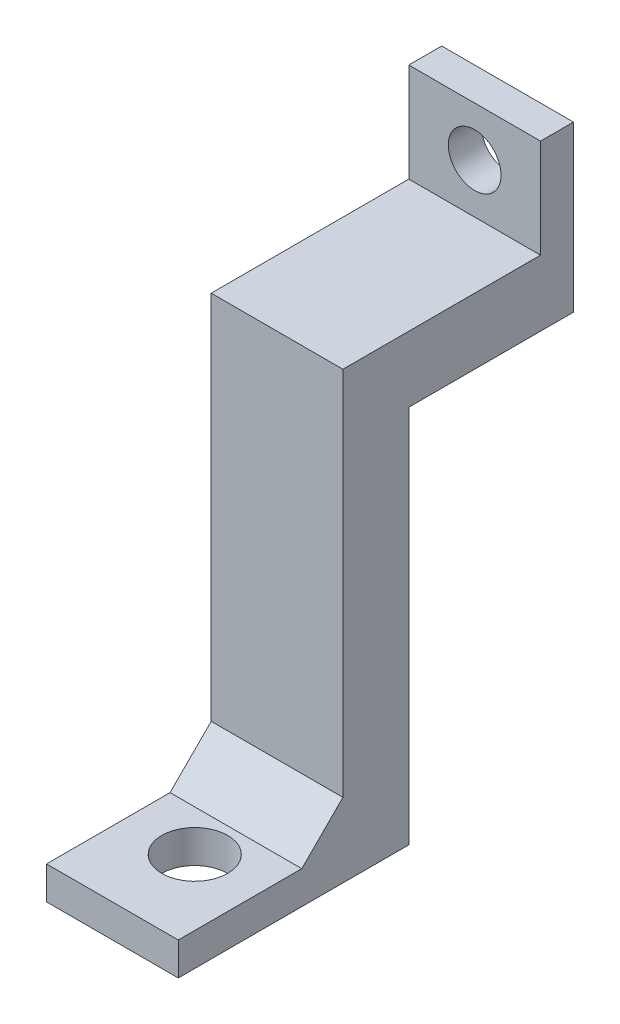
ISO-10303-21;
HEADER;
FILE_DESCRIPTION(('STEP AP214'),'2;1');
FILE_NAME('part.step','',(''),(''),'','','');
FILE_SCHEMA(('AUTOMOTIVE_DESIGN { 1 0 10303 214 1 1 1 1 }'));
ENDSEC;
DATA;
#1=APPLICATION_CONTEXT('core data for automotive mechanical design processes');
#2=APPLICATION_PROTOCOL_DEFINITION('international standard','automotive_design',2000,#1);
#3=PRODUCT_CONTEXT('',#1,'mechanical');
#4=PRODUCT('Part','Part','',(#3));
#5=PRODUCT_RELATED_PRODUCT_CATEGORY('part','',(#4));
#6=PRODUCT_DEFINITION_FORMATION('','',#4);
#7=PRODUCT_DEFINITION_CONTEXT('part definition',#1,'design');
#8=PRODUCT_DEFINITION('design','',#6,#7);
#9=PRODUCT_DEFINITION_SHAPE('','',#8);
#10=(LENGTH_UNIT() NAMED_UNIT(*) SI_UNIT(.MILLI.,.METRE.));
#11=(NAMED_UNIT(*) PLANE_ANGLE_UNIT() SI_UNIT($,.RADIAN.));
#12=(NAMED_UNIT(*) SI_UNIT($,.STERADIAN.) SOLID_ANGLE_UNIT());
#13=UNCERTAINTY_MEASURE_WITH_UNIT(LENGTH_MEASURE(1.E-05),#10,'distance_accuracy_value','');
#14=(GEOMETRIC_REPRESENTATION_CONTEXT(3) GLOBAL_UNCERTAINTY_ASSIGNED_CONTEXT((#13)) GLOBAL_UNIT_ASSIGNED_CONTEXT((#10,
#11,#12)) REPRESENTATION_CONTEXT('',''));
#15=CARTESIAN_POINT('',(0.,0.,0.));
#16=DIRECTION('',(0.,0.,1.));
#17=DIRECTION('',(1.,0.,0.));
#18=AXIS2_PLACEMENT_3D('',#15,#16,#17);
#19=CARTESIAN_POINT('',(8.,0.,-60.2233250620348));
#20=DIRECTION('',(0.,-1.,0.));
#21=DIRECTION('',(0.,0.,-1.));
#22=AXIS2_PLACEMENT_3D('',#19,#20,#21);
#23=PLANE('',#22);
#24=CARTESIAN_POINT('',(4.,0.,-65.2233250620348));
#25=DIRECTION('',(0.,1.,0.));
#26=DIRECTION('',(0.,0.,1.));
#27=AXIS2_PLACEMENT_3D('',#24,#25,#26);
#28=CIRCLE('',#27,2.);
#29=CARTESIAN_POINT('',(4.,0.,-63.2233250620348));
#30=VERTEX_POINT('',#29);
#31=EDGE_CURVE('E267',#30,#30,#28,.T.);
#32=ORIENTED_EDGE('',*,*,#31,.F.);
#33=EDGE_LOOP('',(#32));
#34=FACE_BOUND('',#33,.T.);
#35=DIRECTION('',(0.,0.,1.));
#36=VECTOR('',#35,1.);
#37=CARTESIAN_POINT('',(0.,0.,-60.2233250620348));
#38=LINE('',#37,#36);
#39=CARTESIAN_POINT('',(0.,0.,-67.7233250620348));
#40=VERTEX_POINT('',#39);
#41=CARTESIAN_POINT('',(0.,0.,-60.2233250620348));
#42=VERTEX_POINT('',#41);
#43=EDGE_CURVE('E169',#40,#42,#38,.T.);
#44=ORIENTED_EDGE('',*,*,#43,.T.);
#45=DIRECTION('',(-1.,0.,0.));
#46=VECTOR('',#45,1.);
#47=CARTESIAN_POINT('',(8.,0.,-60.2233250620348));
#48=LINE('',#47,#46);
#49=CARTESIAN_POINT('',(8.,0.,-60.2233250620348));
#50=VERTEX_POINT('',#49);
#51=EDGE_CURVE('E11',#50,#42,#48,.T.);
#52=ORIENTED_EDGE('',*,*,#51,.F.);
#53=DIRECTION('',(0.,0.,1.));
#54=VECTOR('',#53,1.);
#55=CARTESIAN_POINT('',(8.,0.,-60.2233250620348));
#56=LINE('',#55,#54);
#57=CARTESIAN_POINT('',(8.,0.,-67.7233250620348));
#58=VERTEX_POINT('',#57);
#59=EDGE_CURVE('E201',#58,#50,#56,.T.);
#60=ORIENTED_EDGE('',*,*,#59,.F.);
#61=DIRECTION('',(-1.,0.,0.));
#62=VECTOR('',#61,1.);
#63=CARTESIAN_POINT('',(8.,0.,-67.7233250620348));
#64=LINE('',#63,#62);
#65=EDGE_CURVE('E165',#58,#40,#64,.T.);
#66=ORIENTED_EDGE('',*,*,#65,.T.);
#67=EDGE_LOOP('',(#44,#52,#60,#66));
#68=FACE_BOUND('',#67,.T.);
#69=ADVANCED_FACE('F47',(#34,#68),#23,.F.);
#70=CARTESIAN_POINT('',(8.,0.,-60.2233250620348));
#71=DIRECTION('',(0.,0.,-1.));
#72=DIRECTION('',(-1.,0.,0.));
#73=AXIS2_PLACEMENT_3D('',#70,#71,#72);
#74=PLANE('',#73);
#75=DIRECTION('',(0.,-1.,0.));
#76=VECTOR('',#75,1.);
#77=CARTESIAN_POINT('',(0.,0.,-60.2233250620348));
#78=LINE('',#77,#76);
#79=CARTESIAN_POINT('',(0.,-2.,-60.2233250620348));
#80=VERTEX_POINT('',#79);
#81=EDGE_CURVE('E173',#42,#80,#78,.T.);
#82=ORIENTED_EDGE('',*,*,#81,.T.);
#83=DIRECTION('',(-1.,0.,0.));
#84=VECTOR('',#83,1.);
#85=CARTESIAN_POINT('',(8.,-2.,-60.2233250620348));
#86=LINE('',#85,#84);
#87=CARTESIAN_POINT('',(8.,-2.,-60.2233250620348));
#88=VERTEX_POINT('',#87);
#89=EDGE_CURVE('E57',#88,#80,#86,.T.);
#90=ORIENTED_EDGE('',*,*,#89,.F.);
#91=DIRECTION('',(0.,-1.,0.));
#92=VECTOR('',#91,1.);
#93=CARTESIAN_POINT('',(8.,0.,-60.2233250620348));
#94=LINE('',#93,#92);
#95=EDGE_CURVE('E117',#50,#88,#94,.T.);
#96=ORIENTED_EDGE('',*,*,#95,.F.);
#97=ORIENTED_EDGE('',*,*,#51,.T.);
#98=EDGE_LOOP('',(#82,#90,#96,#97));
#99=FACE_BOUND('',#98,.T.);
#100=ADVANCED_FACE('F235',(#99),#74,.F.);
#101=CARTESIAN_POINT('',(8.,-2.,-70.2233250620348));
#102=DIRECTION('',(0.,1.,0.));
#103=DIRECTION('',(0.,0.,1.));
#104=AXIS2_PLACEMENT_3D('',#101,#102,#103);
#105=PLANE('',#104);
#106=CARTESIAN_POINT('',(4.,-2.,-65.2233250620348));
#107=DIRECTION('',(0.,1.,0.));
#108=DIRECTION('',(0.,0.,1.));
#109=AXIS2_PLACEMENT_3D('',#106,#107,#108);
#110=CIRCLE('',#109,2.);
#111=CARTESIAN_POINT('',(4.,-2.,-63.2233250620348));
#112=VERTEX_POINT('',#111);
#113=EDGE_CURVE('E50',#112,#112,#110,.T.);
#114=ORIENTED_EDGE('',*,*,#113,.T.);
#115=EDGE_LOOP('',(#114));
#116=FACE_BOUND('',#115,.T.);
#117=DIRECTION('',(0.,0.,-1.));
#118=VECTOR('',#117,1.);
#119=CARTESIAN_POINT('',(0.,-2.,-70.2233250620348));
#120=LINE('',#119,#118);
#121=CARTESIAN_POINT('',(0.,-2.,-74.2233250620348));
#122=VERTEX_POINT('',#121);
#123=EDGE_CURVE('E178',#80,#122,#120,.T.);
#124=ORIENTED_EDGE('',*,*,#123,.T.);
#125=DIRECTION('',(-1.,0.,0.));
#126=VECTOR('',#125,1.);
#127=CARTESIAN_POINT('',(8.,-2.,-74.2233250620348));
#128=LINE('',#127,#126);
#129=CARTESIAN_POINT('',(8.,-2.,-74.2233250620348));
#130=VERTEX_POINT('',#129);
#131=EDGE_CURVE('E224',#130,#122,#128,.T.);
#132=ORIENTED_EDGE('',*,*,#131,.F.);
#133=DIRECTION('',(0.,0.,-1.));
#134=VECTOR('',#133,1.);
#135=CARTESIAN_POINT('',(8.,-2.,-60.2233250620348));
#136=LINE('',#135,#134);
#137=EDGE_CURVE('E234',#88,#130,#136,.T.);
#138=ORIENTED_EDGE('',*,*,#137,.F.);
#139=ORIENTED_EDGE('',*,*,#89,.T.);
#140=EDGE_LOOP('',(#124,#132,#138,#139));
#141=FACE_BOUND('',#140,.T.);
#142=ADVANCED_FACE('F232',(#116,#141),#105,.F.);
#143=CARTESIAN_POINT('',(8.,-2.,-74.2233250620348));
#144=DIRECTION('',(0.,0.,1.));
#145=DIRECTION('',(1.,0.,0.));
#146=AXIS2_PLACEMENT_3D('',#143,#144,#145);
#147=PLANE('',#146);
#148=DIRECTION('',(0.,1.,0.));
#149=VECTOR('',#148,1.);
#150=CARTESIAN_POINT('',(0.,-2.,-74.2233250620348));
#151=LINE('',#150,#149);
#152=CARTESIAN_POINT('',(0.,21.0176670275042,-74.2233250620348));
#153=VERTEX_POINT('',#152);
#154=EDGE_CURVE('E181',#122,#153,#151,.T.);
#155=ORIENTED_EDGE('',*,*,#154,.T.);
#156=DIRECTION('',(-1.,0.,0.));
#157=VECTOR('',#156,1.);
#158=CARTESIAN_POINT('',(8.,21.0176670275042,-74.2233250620348));
#159=LINE('',#158,#157);
#160=CARTESIAN_POINT('',(8.,21.0176670275042,-74.2233250620348));
#161=VERTEX_POINT('',#160);
#162=EDGE_CURVE('E220',#161,#153,#159,.T.);
#163=ORIENTED_EDGE('',*,*,#162,.F.);
#164=DIRECTION('',(0.,1.,0.));
#165=VECTOR('',#164,1.);
#166=CARTESIAN_POINT('',(8.,-2.,-74.2233250620348));
#167=LINE('',#166,#165);
#168=EDGE_CURVE('E255',#130,#161,#167,.T.);
#169=ORIENTED_EDGE('',*,*,#168,.F.);
#170=ORIENTED_EDGE('',*,*,#131,.T.);
#171=EDGE_LOOP('',(#155,#163,#169,#170));
#172=FACE_BOUND('',#171,.T.);
#173=ADVANCED_FACE('F245',(#172),#147,.F.);
#174=CARTESIAN_POINT('',(8.,21.0176670275042,-74.2233250620348));
#175=DIRECTION('',(0.,1.,0.));
#176=DIRECTION('',(0.,0.,1.));
#177=AXIS2_PLACEMENT_3D('',#174,#175,#176);
#178=PLANE('',#177);
#179=DIRECTION('',(0.,0.,-1.));
#180=VECTOR('',#179,1.);
#181=CARTESIAN_POINT('',(0.,21.0176670275042,-74.2233250620348));
#182=LINE('',#181,#180);
#183=CARTESIAN_POINT('',(0.,21.0176670275042,-84.2233250620348));
#184=VERTEX_POINT('',#183);
#185=EDGE_CURVE('E184',#153,#184,#182,.T.);
#186=ORIENTED_EDGE('',*,*,#185,.T.);
#187=DIRECTION('',(-1.,0.,0.));
#188=VECTOR('',#187,1.);
#189=CARTESIAN_POINT('',(8.,21.0176670275042,-84.2233250620348));
#190=LINE('',#189,#188);
#191=CARTESIAN_POINT('',(8.,21.0176670275042,-84.2233250620348));
#192=VERTEX_POINT('',#191);
#193=EDGE_CURVE('E216',#192,#184,#190,.T.);
#194=ORIENTED_EDGE('',*,*,#193,.F.);
#195=DIRECTION('',(0.,0.,-1.));
#196=VECTOR('',#195,1.);
#197=CARTESIAN_POINT('',(8.,21.0176670275042,-74.2233250620348));
#198=LINE('',#197,#196);
#199=EDGE_CURVE('E251',#161,#192,#198,.T.);
#200=ORIENTED_EDGE('',*,*,#199,.F.);
#201=ORIENTED_EDGE('',*,*,#162,.T.);
#202=EDGE_LOOP('',(#186,#194,#200,#201));
#203=FACE_BOUND('',#202,.T.);
#204=ADVANCED_FACE('F249',(#203),#178,.F.);
#205=CARTESIAN_POINT('',(8.,21.0176670275042,-84.2233250620348));
#206=DIRECTION('',(0.,0.,1.));
#207=DIRECTION('',(1.,0.,0.));
#208=AXIS2_PLACEMENT_3D('',#205,#206,#207);
#209=PLANE('',#208);
#210=CARTESIAN_POINT('',(4.,28.0176670275042,-84.2233250620348));
#211=DIRECTION('',(0.,0.,1.));
#212=DIRECTION('',(1.,0.,0.));
#213=AXIS2_PLACEMENT_3D('',#210,#211,#212);
#214=CIRCLE('',#213,1.6);
#215=CARTESIAN_POINT('',(5.6,28.0176670275042,-84.2233250620348));
#216=VERTEX_POINT('',#215);
#217=EDGE_CURVE('E174',#216,#216,#214,.T.);
#218=ORIENTED_EDGE('',*,*,#217,.T.);
#219=EDGE_LOOP('',(#218));
#220=FACE_BOUND('',#219,.T.);
#221=DIRECTION('',(0.,1.,0.));
#222=VECTOR('',#221,1.);
#223=CARTESIAN_POINT('',(0.,21.0176670275042,-84.2233250620348));
#224=LINE('',#223,#222);
#225=CARTESIAN_POINT('',(0.,31.0176670275042,-84.2233250620348));
#226=VERTEX_POINT('',#225);
#227=EDGE_CURVE('E187',#184,#226,#224,.T.);
#228=ORIENTED_EDGE('',*,*,#227,.T.);
#229=DIRECTION('',(-1.,0.,0.));
#230=VECTOR('',#229,1.);
#231=CARTESIAN_POINT('',(8.,31.0176670275042,-84.2233250620348));
#232=LINE('',#231,#230);
#233=CARTESIAN_POINT('',(8.,31.0176670275042,-84.2233250620348));
#234=VERTEX_POINT('',#233);
#235=EDGE_CURVE('E212',#234,#226,#232,.T.);
#236=ORIENTED_EDGE('',*,*,#235,.F.);
#237=DIRECTION('',(0.,1.,0.));
#238=VECTOR('',#237,1.);
#239=CARTESIAN_POINT('',(8.,21.0176670275042,-84.2233250620348));
#240=LINE('',#239,#238);
#241=EDGE_CURVE('E254',#192,#234,#240,.T.);
#242=ORIENTED_EDGE('',*,*,#241,.F.);
#243=ORIENTED_EDGE('',*,*,#193,.T.);
#244=EDGE_LOOP('',(#228,#236,#242,#243));
#245=FACE_BOUND('',#244,.T.);
#246=ADVANCED_FACE('F298',(#220,#245),#209,.F.);
#247=CARTESIAN_POINT('',(8.,31.0176670275042,-84.2233250620348));
#248=DIRECTION('',(0.,-1.,0.));
#249=DIRECTION('',(0.,0.,-1.));
#250=AXIS2_PLACEMENT_3D('',#247,#248,#249);
#251=PLANE('',#250);
#252=DIRECTION('',(0.,0.,1.));
#253=VECTOR('',#252,1.);
#254=CARTESIAN_POINT('',(0.,31.0176670275042,-84.2233250620348));
#255=LINE('',#254,#253);
#256=CARTESIAN_POINT('',(0.,31.0176670275042,-82.2233250620348));
#257=VERTEX_POINT('',#256);
#258=EDGE_CURVE('E190',#226,#257,#255,.T.);
#259=ORIENTED_EDGE('',*,*,#258,.T.);
#260=DIRECTION('',(-1.,0.,0.));
#261=VECTOR('',#260,1.);
#262=CARTESIAN_POINT('',(8.,31.0176670275042,-82.2233250620348));
#263=LINE('',#262,#261);
#264=CARTESIAN_POINT('',(8.,31.0176670275042,-82.2233250620348));
#265=VERTEX_POINT('',#264);
#266=EDGE_CURVE('E208',#265,#257,#263,.T.);
#267=ORIENTED_EDGE('',*,*,#266,.F.);
#268=DIRECTION('',(0.,0.,1.));
#269=VECTOR('',#268,1.);
#270=CARTESIAN_POINT('',(8.,31.0176670275042,-84.2233250620348));
#271=LINE('',#270,#269);
#272=EDGE_CURVE('E258',#234,#265,#271,.T.);
#273=ORIENTED_EDGE('',*,*,#272,.F.);
#274=ORIENTED_EDGE('',*,*,#235,.T.);
#275=EDGE_LOOP('',(#259,#267,#273,#274));
#276=FACE_BOUND('',#275,.T.);
#277=ADVANCED_FACE('F295',(#276),#251,.F.);
#278=CARTESIAN_POINT('',(8.,25.0176670275042,-82.2233250620348));
#279=DIRECTION('',(0.,0.,-1.));
#280=DIRECTION('',(0.,1.,0.));
#281=AXIS2_PLACEMENT_3D('',#278,#279,#280);
#282=PLANE('',#281);
#283=CARTESIAN_POINT('',(4.,28.0176670275042,-82.2233250620348));
#284=DIRECTION('',(0.,0.,1.));
#285=DIRECTION('',(1.,0.,0.));
#286=AXIS2_PLACEMENT_3D('',#283,#284,#285);
#287=CIRCLE('',#286,1.6);
#288=CARTESIAN_POINT('',(5.6,28.0176670275042,-82.2233250620348));
#289=VERTEX_POINT('',#288);
#290=EDGE_CURVE('E274',#289,#289,#287,.T.);
#291=ORIENTED_EDGE('',*,*,#290,.F.);
#292=EDGE_LOOP('',(#291));
#293=FACE_BOUND('',#292,.T.);
#294=DIRECTION('',(0.,-1.,0.));
#295=VECTOR('',#294,1.);
#296=CARTESIAN_POINT('',(0.,25.0176670275042,-82.2233250620348));
#297=LINE('',#296,#295);
#298=CARTESIAN_POINT('',(0.,25.0176670275042,-82.2233250620348));
#299=VERTEX_POINT('',#298);
#300=EDGE_CURVE('E193',#257,#299,#297,.T.);
#301=ORIENTED_EDGE('',*,*,#300,.T.);
#302=DIRECTION('',(-1.,0.,0.));
#303=VECTOR('',#302,1.);
#304=CARTESIAN_POINT('',(8.,25.0176670275042,-82.2233250620348));
#305=LINE('',#304,#303);
#306=CARTESIAN_POINT('',(8.,25.0176670275042,-82.2233250620348));
#307=VERTEX_POINT('',#306);
#308=EDGE_CURVE('E156',#307,#299,#305,.T.);
#309=ORIENTED_EDGE('',*,*,#308,.F.);
#310=DIRECTION('',(0.,-1.,0.));
#311=VECTOR('',#310,1.);
#312=CARTESIAN_POINT('',(8.,25.0176670275042,-82.2233250620348));
#313=LINE('',#312,#311);
#314=EDGE_CURVE('E145',#265,#307,#313,.T.);
#315=ORIENTED_EDGE('',*,*,#314,.F.);
#316=ORIENTED_EDGE('',*,*,#266,.T.);
#317=EDGE_LOOP('',(#301,#309,#315,#316));
#318=FACE_BOUND('',#317,.T.);
#319=ADVANCED_FACE('F291',(#293,#318),#282,.F.);
#320=CARTESIAN_POINT('',(8.,25.0176670275042,-70.2233250620348));
#321=DIRECTION('',(0.,-1.,0.));
#322=DIRECTION('',(0.,0.,-1.));
#323=AXIS2_PLACEMENT_3D('',#320,#321,#322);
#324=PLANE('',#323);
#325=DIRECTION('',(0.,0.,1.));
#326=VECTOR('',#325,1.);
#327=CARTESIAN_POINT('',(0.,25.0176670275042,-70.2233250620348));
#328=LINE('',#327,#326);
#329=CARTESIAN_POINT('',(0.,25.0176670275042,-70.2233250620348));
#330=VERTEX_POINT('',#329);
#331=EDGE_CURVE('E154',#299,#330,#328,.T.);
#332=ORIENTED_EDGE('',*,*,#331,.T.);
#333=DIRECTION('',(-1.,0.,0.));
#334=VECTOR('',#333,1.);
#335=CARTESIAN_POINT('',(8.,25.0176670275042,-70.2233250620348));
#336=LINE('',#335,#334);
#337=CARTESIAN_POINT('',(8.,25.0176670275042,-70.2233250620348));
#338=VERTEX_POINT('',#337);
#339=EDGE_CURVE('E151',#338,#330,#336,.T.);
#340=ORIENTED_EDGE('',*,*,#339,.F.);
#341=DIRECTION('',(0.,0.,1.));
#342=VECTOR('',#341,1.);
#343=CARTESIAN_POINT('',(8.,25.0176670275042,-70.2233250620348));
#344=LINE('',#343,#342);
#345=EDGE_CURVE('E139',#307,#338,#344,.T.);
#346=ORIENTED_EDGE('',*,*,#345,.F.);
#347=ORIENTED_EDGE('',*,*,#308,.T.);
#348=EDGE_LOOP('',(#332,#340,#346,#347));
#349=FACE_BOUND('',#348,.T.);
#350=ADVANCED_FACE('F152',(#349),#324,.F.);
#351=CARTESIAN_POINT('',(8.,2.5,-70.2233250620348));
#352=DIRECTION('',(0.,0.,-1.));
#353=DIRECTION('',(-1.,0.,0.));
#354=AXIS2_PLACEMENT_3D('',#351,#352,#353);
#355=PLANE('',#354);
#356=DIRECTION('',(0.,-1.,0.));
#357=VECTOR('',#356,1.);
#358=CARTESIAN_POINT('',(0.,2.5,-70.2233250620348));
#359=LINE('',#358,#357);
#360=CARTESIAN_POINT('',(0.,2.5,-70.2233250620348));
#361=VERTEX_POINT('',#360);
#362=EDGE_CURVE('E103',#330,#361,#359,.T.);
#363=ORIENTED_EDGE('',*,*,#362,.T.);
#364=DIRECTION('',(-1.,0.,0.));
#365=VECTOR('',#364,1.);
#366=CARTESIAN_POINT('',(8.,2.5,-70.2233250620348));
#367=LINE('',#366,#365);
#368=CARTESIAN_POINT('',(8.,2.5,-70.2233250620348));
#369=VERTEX_POINT('',#368);
#370=EDGE_CURVE('E157',#369,#361,#367,.T.);
#371=ORIENTED_EDGE('',*,*,#370,.F.);
#372=DIRECTION('',(0.,-1.,0.));
#373=VECTOR('',#372,1.);
#374=CARTESIAN_POINT('',(8.,2.5,-70.2233250620348));
#375=LINE('',#374,#373);
#376=EDGE_CURVE('E143',#338,#369,#375,.T.);
#377=ORIENTED_EDGE('',*,*,#376,.F.);
#378=ORIENTED_EDGE('',*,*,#339,.T.);
#379=EDGE_LOOP('',(#363,#371,#377,#378));
#380=FACE_BOUND('',#379,.T.);
#381=ADVANCED_FACE('F159',(#380),#355,.F.);
#382=CARTESIAN_POINT('',(8.,0.,-67.7233250620348));
#383=DIRECTION('',(0.,-0.707106781186548,-0.707106781186547));
#384=DIRECTION('',(0.,0.707106781186547,-0.707106781186548));
#385=AXIS2_PLACEMENT_3D('',#382,#383,#384);
#386=PLANE('',#385);
#387=DIRECTION('',(0.,-0.707106781186547,0.707106781186548));
#388=VECTOR('',#387,1.);
#389=CARTESIAN_POINT('',(0.,0.,-67.7233250620348));
#390=LINE('',#389,#388);
#391=EDGE_CURVE('E109',#361,#40,#390,.T.);
#392=ORIENTED_EDGE('',*,*,#391,.T.);
#393=ORIENTED_EDGE('',*,*,#65,.F.);
#394=DIRECTION('',(0.,-0.707106781186547,0.707106781186548));
#395=VECTOR('',#394,1.);
#396=CARTESIAN_POINT('',(8.,0.,-67.7233250620348));
#397=LINE('',#396,#395);
#398=EDGE_CURVE('E65',#369,#58,#397,.T.);
#399=ORIENTED_EDGE('',*,*,#398,.F.);
#400=ORIENTED_EDGE('',*,*,#370,.T.);
#401=EDGE_LOOP('',(#392,#393,#399,#400));
#402=FACE_BOUND('',#401,.T.);
#403=ADVANCED_FACE('F287',(#402),#386,.F.);
#404=CARTESIAN_POINT('',(8.,0.,0.));
#405=DIRECTION('',(1.,0.,0.));
#406=DIRECTION('',(0.,0.,-1.));
#407=AXIS2_PLACEMENT_3D('',#404,#405,#406);
#408=PLANE('',#407);
#409=ORIENTED_EDGE('',*,*,#59,.T.);
#410=ORIENTED_EDGE('',*,*,#95,.T.);
#411=ORIENTED_EDGE('',*,*,#137,.T.);
#412=ORIENTED_EDGE('',*,*,#168,.T.);
#413=ORIENTED_EDGE('',*,*,#199,.T.);
#414=ORIENTED_EDGE('',*,*,#241,.T.);
#415=ORIENTED_EDGE('',*,*,#272,.T.);
#416=ORIENTED_EDGE('',*,*,#314,.T.);
#417=ORIENTED_EDGE('',*,*,#345,.T.);
#418=ORIENTED_EDGE('',*,*,#376,.T.);
#419=ORIENTED_EDGE('',*,*,#398,.T.);
#420=EDGE_LOOP('',(#409,#410,#411,#412,#413,#414,#415,#416,#417,#418,#419));
#421=FACE_BOUND('',#420,.T.);
#422=ADVANCED_FACE('F141',(#421),#408,.T.);
#423=CARTESIAN_POINT('',(0.,0.,0.));
#424=DIRECTION('',(1.,0.,0.));
#425=DIRECTION('',(0.,0.,-1.));
#426=AXIS2_PLACEMENT_3D('',#423,#424,#425);
#427=PLANE('',#426);
#428=ORIENTED_EDGE('',*,*,#43,.F.);
#429=ORIENTED_EDGE('',*,*,#391,.F.);
#430=ORIENTED_EDGE('',*,*,#362,.F.);
#431=ORIENTED_EDGE('',*,*,#331,.F.);
#432=ORIENTED_EDGE('',*,*,#300,.F.);
#433=ORIENTED_EDGE('',*,*,#258,.F.);
#434=ORIENTED_EDGE('',*,*,#227,.F.);
#435=ORIENTED_EDGE('',*,*,#185,.F.);
#436=ORIENTED_EDGE('',*,*,#154,.F.);
#437=ORIENTED_EDGE('',*,*,#123,.F.);
#438=ORIENTED_EDGE('',*,*,#81,.F.);
#439=EDGE_LOOP('',(#428,#429,#430,#431,#432,#433,#434,#435,#436,#437,#438));
#440=FACE_BOUND('',#439,.T.);
#441=ADVANCED_FACE('F239',(#440),#427,.F.);
#442=CARTESIAN_POINT('',(4.,28.0176670275042,-92.2233250620348));
#443=DIRECTION('',(0.,0.,1.));
#444=DIRECTION('',(1.,0.,0.));
#445=AXIS2_PLACEMENT_3D('',#442,#443,#444);
#446=CYLINDRICAL_SURFACE('',#445,1.6);
#447=ORIENTED_EDGE('',*,*,#290,.T.);
#448=EDGE_LOOP('',(#447));
#449=FACE_BOUND('',#448,.T.);
#450=ORIENTED_EDGE('',*,*,#217,.F.);
#451=EDGE_LOOP('',(#450));
#452=FACE_BOUND('',#451,.T.);
#453=ADVANCED_FACE('F372',(#449,#452),#446,.F.);
#454=CARTESIAN_POINT('',(4.,-10.,-65.2233250620348));
#455=DIRECTION('',(0.,1.,0.));
#456=DIRECTION('',(0.,0.,1.));
#457=AXIS2_PLACEMENT_3D('',#454,#455,#456);
#458=CYLINDRICAL_SURFACE('',#457,2.);
#459=ORIENTED_EDGE('',*,*,#31,.T.);
#460=EDGE_LOOP('',(#459));
#461=FACE_BOUND('',#460,.T.);
#462=ORIENTED_EDGE('',*,*,#113,.F.);
#463=EDGE_LOOP('',(#462));
#464=FACE_BOUND('',#463,.T.);
#465=ADVANCED_FACE('F392',(#461,#464),#458,.F.);
#466=CLOSED_SHELL('',(#69,#100,#142,#173,#204,#246,#277,#319,#350,#381,#403,#422,#441,#453,#465));
#467=MANIFOLD_SOLID_BREP('B2',#466);
#468=ADVANCED_BREP_SHAPE_REPRESENTATION('',(#18,#467),#14);
#469=SHAPE_DEFINITION_REPRESENTATION(#9,#468);
ENDSEC;
END-ISO-10303-21;
